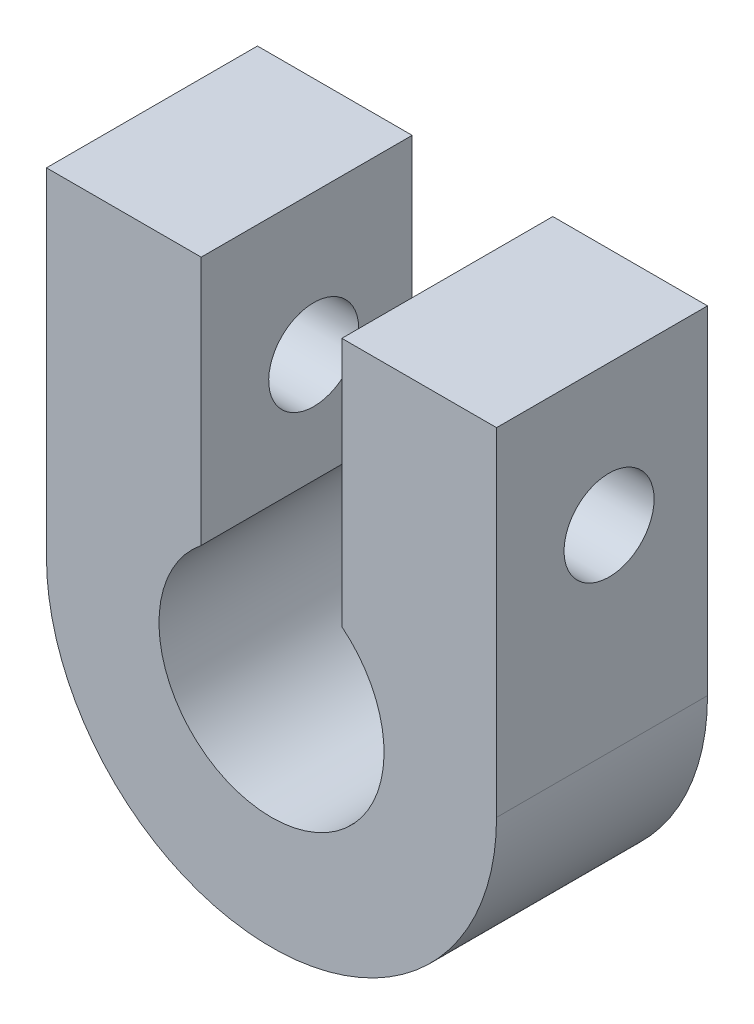
ISO-10303-21;
HEADER;
FILE_DESCRIPTION(('STEP AP214'),'2;1');
FILE_NAME('part.step','',(''),(''),'','','');
FILE_SCHEMA(('AUTOMOTIVE_DESIGN { 1 0 10303 214 1 1 1 1 }'));
ENDSEC;
DATA;
#1=APPLICATION_CONTEXT('core data for automotive mechanical design processes');
#2=APPLICATION_PROTOCOL_DEFINITION('international standard','automotive_design',2000,#1);
#3=PRODUCT_CONTEXT('',#1,'mechanical');
#4=PRODUCT('Part','Part','',(#3));
#5=PRODUCT_RELATED_PRODUCT_CATEGORY('part','',(#4));
#6=PRODUCT_DEFINITION_FORMATION('','',#4);
#7=PRODUCT_DEFINITION_CONTEXT('part definition',#1,'design');
#8=PRODUCT_DEFINITION('design','',#6,#7);
#9=PRODUCT_DEFINITION_SHAPE('','',#8);
#10=(LENGTH_UNIT() NAMED_UNIT(*) SI_UNIT(.MILLI.,.METRE.));
#11=(NAMED_UNIT(*) PLANE_ANGLE_UNIT() SI_UNIT($,.RADIAN.));
#12=(NAMED_UNIT(*) SI_UNIT($,.STERADIAN.) SOLID_ANGLE_UNIT());
#13=UNCERTAINTY_MEASURE_WITH_UNIT(LENGTH_MEASURE(1.E-05),#10,'distance_accuracy_value','');
#14=(GEOMETRIC_REPRESENTATION_CONTEXT(3) GLOBAL_UNCERTAINTY_ASSIGNED_CONTEXT((#13)) GLOBAL_UNIT_ASSIGNED_CONTEXT((#10,
#11,#12)) REPRESENTATION_CONTEXT('',''));
#15=CARTESIAN_POINT('',(0.,0.,0.));
#16=DIRECTION('',(0.,0.,1.));
#17=DIRECTION('',(1.,0.,0.));
#18=AXIS2_PLACEMENT_3D('',#15,#16,#17);
#19=CARTESIAN_POINT('',(8.,12.,0.));
#20=DIRECTION('',(0.,1.,0.));
#21=DIRECTION('',(0.,0.,1.));
#22=AXIS2_PLACEMENT_3D('',#19,#20,#21);
#23=PLANE('',#22);
#24=DIRECTION('',(0.,0.,-1.));
#25=VECTOR('',#24,1.);
#26=CARTESIAN_POINT('',(-2.5,12.,8.));
#27=LINE('',#26,#25);
#28=CARTESIAN_POINT('',(-2.5,12.,8.));
#29=VERTEX_POINT('',#28);
#30=CARTESIAN_POINT('',(-2.5,12.,0.500000000000002));
#31=VERTEX_POINT('',#30);
#32=EDGE_CURVE('E181',#29,#31,#27,.T.);
#33=ORIENTED_EDGE('',*,*,#32,.T.);
#34=DIRECTION('',(-1.,0.,0.));
#35=VECTOR('',#34,1.);
#36=CARTESIAN_POINT('',(-8.,12.,0.500000000000002));
#37=LINE('',#36,#35);
#38=CARTESIAN_POINT('',(-8.,12.,0.500000000000002));
#39=VERTEX_POINT('',#38);
#40=EDGE_CURVE('E209',#31,#39,#37,.T.);
#41=ORIENTED_EDGE('',*,*,#40,.T.);
#42=DIRECTION('',(0.,0.,1.));
#43=VECTOR('',#42,1.);
#44=CARTESIAN_POINT('',(-8.,12.,0.));
#45=LINE('',#44,#43);
#46=CARTESIAN_POINT('',(-8.,12.,8.));
#47=VERTEX_POINT('',#46);
#48=EDGE_CURVE('E210',#39,#47,#45,.T.);
#49=ORIENTED_EDGE('',*,*,#48,.T.);
#50=DIRECTION('',(-1.,0.,0.));
#51=VECTOR('',#50,1.);
#52=CARTESIAN_POINT('',(8.,12.,8.));
#53=LINE('',#52,#51);
#54=EDGE_CURVE('E200',#29,#47,#53,.T.);
#55=ORIENTED_EDGE('',*,*,#54,.F.);
#56=EDGE_LOOP('',(#33,#41,#49,#55));
#57=FACE_BOUND('',#56,.T.);
#58=ADVANCED_FACE('F34',(#57),#23,.T.);
#59=CARTESIAN_POINT('',(0.,0.,0.));
#60=DIRECTION('',(0.,0.,1.));
#61=DIRECTION('',(1.,0.,0.));
#62=AXIS2_PLACEMENT_3D('',#59,#60,#61);
#63=CYLINDRICAL_SURFACE('',#62,8.);
#64=DIRECTION('',(0.,0.,1.));
#65=VECTOR('',#64,1.);
#66=CARTESIAN_POINT('',(-8.,0.,0.));
#67=LINE('',#66,#65);
#68=CARTESIAN_POINT('',(-8.,0.,0.500000000000002));
#69=VERTEX_POINT('',#68);
#70=CARTESIAN_POINT('',(-8.,0.,8.));
#71=VERTEX_POINT('',#70);
#72=EDGE_CURVE('E207',#69,#71,#67,.T.);
#73=ORIENTED_EDGE('',*,*,#72,.F.);
#74=CARTESIAN_POINT('',(0.,0.,0.500000000000002));
#75=DIRECTION('',(0.,0.,1.));
#76=DIRECTION('',(1.,0.,0.));
#77=AXIS2_PLACEMENT_3D('',#74,#75,#76);
#78=CIRCLE('',#77,8.);
#79=CARTESIAN_POINT('',(8.,0.,0.500000000000002));
#80=VERTEX_POINT('',#79);
#81=EDGE_CURVE('E236',#69,#80,#78,.T.);
#82=ORIENTED_EDGE('',*,*,#81,.T.);
#83=DIRECTION('',(0.,0.,1.));
#84=VECTOR('',#83,1.);
#85=CARTESIAN_POINT('',(8.,0.,0.));
#86=LINE('',#85,#84);
#87=CARTESIAN_POINT('',(8.,0.,8.));
#88=VERTEX_POINT('',#87);
#89=EDGE_CURVE('E206',#80,#88,#86,.T.);
#90=ORIENTED_EDGE('',*,*,#89,.T.);
#91=CARTESIAN_POINT('',(0.,0.,8.));
#92=DIRECTION('',(0.,0.,1.));
#93=DIRECTION('',(1.,0.,0.));
#94=AXIS2_PLACEMENT_3D('',#91,#92,#93);
#95=CIRCLE('',#94,8.);
#96=EDGE_CURVE('E164',#71,#88,#95,.T.);
#97=ORIENTED_EDGE('',*,*,#96,.F.);
#98=EDGE_LOOP('',(#73,#82,#90,#97));
#99=FACE_BOUND('',#98,.T.);
#100=ADVANCED_FACE('F386',(#99),#63,.T.);
#101=CARTESIAN_POINT('',(-8.,12.,0.));
#102=DIRECTION('',(-1.,0.,0.));
#103=DIRECTION('',(0.,0.,1.));
#104=AXIS2_PLACEMENT_3D('',#101,#102,#103);
#105=PLANE('',#104);
#106=DIRECTION('',(0.,0.,1.));
#107=VECTOR('',#106,1.);
#108=CARTESIAN_POINT('',(-8.,4.100001352125,2.325685));
#109=LINE('',#108,#107);
#110=CARTESIAN_POINT('',(-8.,4.100001352125,2.325685));
#111=VERTEX_POINT('',#110);
#112=CARTESIAN_POINT('',(-8.,4.10000135212497,5.67431499999981));
#113=VERTEX_POINT('',#112);
#114=EDGE_CURVE('E176',#111,#113,#109,.T.);
#115=ORIENTED_EDGE('',*,*,#114,.F.);
#116=DIRECTION('',(0.,-0.866025403784429,0.500000000000017));
#117=VECTOR('',#116,1.);
#118=CARTESIAN_POINT('',(-8.,6.99999999999989,0.651369999999807));
#119=LINE('',#118,#117);
#120=CARTESIAN_POINT('',(-8.,6.99999999999989,0.651369999999807));
#121=VERTEX_POINT('',#120);
#122=EDGE_CURVE('E312',#121,#111,#119,.T.);
#123=ORIENTED_EDGE('',*,*,#122,.F.);
#124=DIRECTION('',(0.,-0.866025403784439,-0.5));
#125=VECTOR('',#124,1.);
#126=CARTESIAN_POINT('',(-8.,9.89999864787498,2.32568500000004));
#127=LINE('',#126,#125);
#128=CARTESIAN_POINT('',(-8.,9.89999864787498,2.32568500000004));
#129=VERTEX_POINT('',#128);
#130=EDGE_CURVE('E337',#129,#121,#127,.T.);
#131=ORIENTED_EDGE('',*,*,#130,.F.);
#132=DIRECTION('',(0.,0.,-1.));
#133=VECTOR('',#132,1.);
#134=CARTESIAN_POINT('',(-8.,9.89999864787498,5.67431499999985));
#135=LINE('',#134,#133);
#136=CARTESIAN_POINT('',(-8.,9.89999864787498,5.67431499999985));
#137=VERTEX_POINT('',#136);
#138=EDGE_CURVE('E334',#137,#129,#135,.T.);
#139=ORIENTED_EDGE('',*,*,#138,.F.);
#140=DIRECTION('',(0.,0.866025403784431,-0.500000000000013));
#141=VECTOR('',#140,1.);
#142=CARTESIAN_POINT('',(-8.,7.00000000000006,7.34863000000004));
#143=LINE('',#142,#141);
#144=CARTESIAN_POINT('',(-8.,7.00000000000006,7.34863000000004));
#145=VERTEX_POINT('',#144);
#146=EDGE_CURVE('E331',#145,#137,#143,.T.);
#147=ORIENTED_EDGE('',*,*,#146,.F.);
#148=DIRECTION('',(0.,0.866025403784439,0.5));
#149=VECTOR('',#148,1.);
#150=CARTESIAN_POINT('',(-8.,4.10000135212497,5.67431499999981));
#151=LINE('',#150,#149);
#152=EDGE_CURVE('E328',#113,#145,#151,.T.);
#153=ORIENTED_EDGE('',*,*,#152,.F.);
#154=EDGE_LOOP('',(#115,#123,#131,#139,#147,#153));
#155=FACE_BOUND('',#154,.T.);
#156=ORIENTED_EDGE('',*,*,#48,.F.);
#157=DIRECTION('',(0.,-1.,0.));
#158=VECTOR('',#157,1.);
#159=CARTESIAN_POINT('',(-8.,0.,0.500000000000002));
#160=LINE('',#159,#158);
#161=EDGE_CURVE('E234',#39,#69,#160,.T.);
#162=ORIENTED_EDGE('',*,*,#161,.T.);
#163=ORIENTED_EDGE('',*,*,#72,.T.);
#164=DIRECTION('',(0.,-1.,0.));
#165=VECTOR('',#164,1.);
#166=CARTESIAN_POINT('',(-8.,12.,8.));
#167=LINE('',#166,#165);
#168=EDGE_CURVE('E203',#47,#71,#167,.T.);
#169=ORIENTED_EDGE('',*,*,#168,.F.);
#170=EDGE_LOOP('',(#156,#162,#163,#169));
#171=FACE_BOUND('',#170,.T.);
#172=ADVANCED_FACE('F359',(#155,#171),#105,.T.);
#173=DIRECTION('',(0.,0.,1.));
#174=VECTOR('',#173,1.);
#175=CARTESIAN_POINT('',(8.,12.,0.));
#176=LINE('',#175,#174);
#177=CARTESIAN_POINT('',(8.,12.,0.500000000000002));
#178=VERTEX_POINT('',#177);
#179=CARTESIAN_POINT('',(8.,12.,8.));
#180=VERTEX_POINT('',#179);
#181=EDGE_CURVE('E212',#178,#180,#176,.T.);
#182=ORIENTED_EDGE('',*,*,#181,.F.);
#183=DIRECTION('',(-1.,0.,0.));
#184=VECTOR('',#183,1.);
#185=CARTESIAN_POINT('',(2.5,12.,0.500000000000002));
#186=LINE('',#185,#184);
#187=CARTESIAN_POINT('',(2.5,12.,0.500000000000002));
#188=VERTEX_POINT('',#187);
#189=EDGE_CURVE('E240',#178,#188,#186,.T.);
#190=ORIENTED_EDGE('',*,*,#189,.T.);
#191=DIRECTION('',(0.,0.,-1.));
#192=VECTOR('',#191,1.);
#193=CARTESIAN_POINT('',(2.5,12.,8.));
#194=LINE('',#193,#192);
#195=CARTESIAN_POINT('',(2.5,12.,8.));
#196=VERTEX_POINT('',#195);
#197=EDGE_CURVE('E192',#196,#188,#194,.T.);
#198=ORIENTED_EDGE('',*,*,#197,.F.);
#199=EDGE_CURVE('E201',#180,#196,#53,.T.);
#200=ORIENTED_EDGE('',*,*,#199,.F.);
#201=EDGE_LOOP('',(#182,#190,#198,#200));
#202=FACE_BOUND('',#201,.T.);
#203=ADVANCED_FACE('F389',(#202),#23,.T.);
#204=CARTESIAN_POINT('',(8.,0.,0.));
#205=DIRECTION('',(1.,0.,0.));
#206=DIRECTION('',(0.,0.,-1.));
#207=AXIS2_PLACEMENT_3D('',#204,#205,#206);
#208=PLANE('',#207);
#209=CARTESIAN_POINT('',(8.,6.99999999999986,3.99999999999988));
#210=DIRECTION('',(1.,0.,0.));
#211=DIRECTION('',(0.,0.,-1.));
#212=AXIS2_PLACEMENT_3D('',#209,#210,#211);
#213=CIRCLE('',#212,1.59999999999975);
#214=CARTESIAN_POINT('',(8.,6.99999999999986,2.40000000000013));
#215=VERTEX_POINT('',#214);
#216=EDGE_CURVE('E292',#215,#215,#213,.T.);
#217=ORIENTED_EDGE('',*,*,#216,.F.);
#218=EDGE_LOOP('',(#217));
#219=FACE_BOUND('',#218,.T.);
#220=ORIENTED_EDGE('',*,*,#89,.F.);
#221=DIRECTION('',(0.,1.,0.));
#222=VECTOR('',#221,1.);
#223=CARTESIAN_POINT('',(8.,12.,0.500000000000002));
#224=LINE('',#223,#222);
#225=EDGE_CURVE('E238',#80,#178,#224,.T.);
#226=ORIENTED_EDGE('',*,*,#225,.T.);
#227=ORIENTED_EDGE('',*,*,#181,.T.);
#228=DIRECTION('',(0.,1.,0.));
#229=VECTOR('',#228,1.);
#230=CARTESIAN_POINT('',(8.,0.,8.));
#231=LINE('',#230,#229);
#232=EDGE_CURVE('E197',#88,#180,#231,.T.);
#233=ORIENTED_EDGE('',*,*,#232,.F.);
#234=EDGE_LOOP('',(#220,#226,#227,#233));
#235=FACE_BOUND('',#234,.T.);
#236=ADVANCED_FACE('F398',(#219,#235),#208,.T.);
#237=CARTESIAN_POINT('',(0.,0.,0.));
#238=DIRECTION('',(0.,0.,1.));
#239=DIRECTION('',(1.,0.,0.));
#240=AXIS2_PLACEMENT_3D('',#237,#238,#239);
#241=PLANE('',#240);
#242=DIRECTION('',(0.,1.,0.));
#243=VECTOR('',#242,1.);
#244=CARTESIAN_POINT('',(-7.5,12.,0.));
#245=LINE('',#244,#243);
#246=CARTESIAN_POINT('',(-7.5,0.,0.));
#247=VERTEX_POINT('',#246);
#248=CARTESIAN_POINT('',(-7.5,11.5,0.));
#249=VERTEX_POINT('',#248);
#250=EDGE_CURVE('E229',#247,#249,#245,.T.);
#251=ORIENTED_EDGE('',*,*,#250,.T.);
#252=DIRECTION('',(1.,0.,0.));
#253=VECTOR('',#252,1.);
#254=CARTESIAN_POINT('',(-2.5,11.5,0.));
#255=LINE('',#254,#253);
#256=CARTESIAN_POINT('',(-3.,11.5,0.));
#257=VERTEX_POINT('',#256);
#258=EDGE_CURVE('E231',#249,#257,#255,.T.);
#259=ORIENTED_EDGE('',*,*,#258,.T.);
#260=DIRECTION('',(0.,-1.,0.));
#261=VECTOR('',#260,1.);
#262=CARTESIAN_POINT('',(-3.00000000000007,0.,0.));
#263=LINE('',#262,#261);
#264=CARTESIAN_POINT('',(-2.99999999999927,3.35410196625034,0.));
#265=VERTEX_POINT('',#264);
#266=EDGE_CURVE('E221',#257,#265,#263,.T.);
#267=ORIENTED_EDGE('',*,*,#266,.T.);
#268=CARTESIAN_POINT('',(0.,0.,0.));
#269=DIRECTION('',(0.,0.,1.));
#270=DIRECTION('',(1.,0.,0.));
#271=AXIS2_PLACEMENT_3D('',#268,#269,#270);
#272=CIRCLE('',#271,4.5);
#273=CARTESIAN_POINT('',(3.00000000000005,3.35410196625034,0.));
#274=VERTEX_POINT('',#273);
#275=EDGE_CURVE('E219',#265,#274,#272,.T.);
#276=ORIENTED_EDGE('',*,*,#275,.T.);
#277=DIRECTION('',(0.,1.,0.));
#278=VECTOR('',#277,1.);
#279=CARTESIAN_POINT('',(3.00000000000007,0.,0.));
#280=LINE('',#279,#278);
#281=CARTESIAN_POINT('',(3.,11.5,0.));
#282=VERTEX_POINT('',#281);
#283=EDGE_CURVE('E217',#274,#282,#280,.T.);
#284=ORIENTED_EDGE('',*,*,#283,.T.);
#285=DIRECTION('',(1.,0.,0.));
#286=VECTOR('',#285,1.);
#287=CARTESIAN_POINT('',(8.,11.5,0.));
#288=LINE('',#287,#286);
#289=CARTESIAN_POINT('',(7.5,11.5,0.));
#290=VERTEX_POINT('',#289);
#291=EDGE_CURVE('E223',#282,#290,#288,.T.);
#292=ORIENTED_EDGE('',*,*,#291,.T.);
#293=DIRECTION('',(0.,-1.,0.));
#294=VECTOR('',#293,1.);
#295=CARTESIAN_POINT('',(7.5,0.,0.));
#296=LINE('',#295,#294);
#297=CARTESIAN_POINT('',(7.5,0.,0.));
#298=VERTEX_POINT('',#297);
#299=EDGE_CURVE('E225',#290,#298,#296,.T.);
#300=ORIENTED_EDGE('',*,*,#299,.T.);
#301=CARTESIAN_POINT('',(0.,0.,0.));
#302=DIRECTION('',(0.,0.,1.));
#303=DIRECTION('',(1.,0.,0.));
#304=AXIS2_PLACEMENT_3D('',#301,#302,#303);
#305=CIRCLE('',#304,7.5);
#306=EDGE_CURVE('E227',#298,#247,#305,.F.);
#307=ORIENTED_EDGE('',*,*,#306,.T.);
#308=EDGE_LOOP('',(#251,#259,#267,#276,#284,#292,#300,#307));
#309=FACE_BOUND('',#308,.T.);
#310=ADVANCED_FACE('F404',(#309),#241,.F.);
#311=CARTESIAN_POINT('',(0.,0.,8.));
#312=DIRECTION('',(0.,0.,1.));
#313=DIRECTION('',(1.,0.,0.));
#314=AXIS2_PLACEMENT_3D('',#311,#312,#313);
#315=PLANE('',#314);
#316=CARTESIAN_POINT('',(0.,0.,8.));
#317=DIRECTION('',(0.,0.,1.));
#318=DIRECTION('',(1.,0.,0.));
#319=AXIS2_PLACEMENT_3D('',#316,#317,#318);
#320=CIRCLE('',#319,4.);
#321=CARTESIAN_POINT('',(-2.50000000000005,3.12249899919916,8.));
#322=VERTEX_POINT('',#321);
#323=CARTESIAN_POINT('',(2.50000000000005,3.12249899919916,8.));
#324=VERTEX_POINT('',#323);
#325=EDGE_CURVE('E160',#322,#324,#320,.T.);
#326=ORIENTED_EDGE('',*,*,#325,.F.);
#327=DIRECTION('',(0.,1.,0.));
#328=VECTOR('',#327,1.);
#329=CARTESIAN_POINT('',(-2.50000000000005,3.12249899919916,8.));
#330=LINE('',#329,#328);
#331=EDGE_CURVE('E172',#322,#29,#330,.T.);
#332=ORIENTED_EDGE('',*,*,#331,.T.);
#333=ORIENTED_EDGE('',*,*,#54,.T.);
#334=ORIENTED_EDGE('',*,*,#168,.T.);
#335=ORIENTED_EDGE('',*,*,#96,.T.);
#336=ORIENTED_EDGE('',*,*,#232,.T.);
#337=ORIENTED_EDGE('',*,*,#199,.T.);
#338=DIRECTION('',(0.,-1.,0.));
#339=VECTOR('',#338,1.);
#340=CARTESIAN_POINT('',(2.5,12.,8.));
#341=LINE('',#340,#339);
#342=EDGE_CURVE('E175',#196,#324,#341,.T.);
#343=ORIENTED_EDGE('',*,*,#342,.T.);
#344=EDGE_LOOP('',(#326,#332,#333,#334,#335,#336,#337,#343));
#345=FACE_BOUND('',#344,.T.);
#346=ADVANCED_FACE('F170',(#345),#315,.T.);
#347=CARTESIAN_POINT('',(-2.50000000000005,3.12249899919916,8.));
#348=DIRECTION('',(-1.,0.,0.));
#349=DIRECTION('',(0.,-1.,0.));
#350=AXIS2_PLACEMENT_3D('',#347,#348,#349);
#351=PLANE('',#350);
#352=CARTESIAN_POINT('',(-2.50000000000003,6.99999999999986,3.99999999999988));
#353=DIRECTION('',(-1.,0.,0.));
#354=DIRECTION('',(0.,-1.,0.));
#355=AXIS2_PLACEMENT_3D('',#352,#353,#354);
#356=CIRCLE('',#355,1.59999999999975);
#357=CARTESIAN_POINT('',(-2.50000000000004,5.40000000000011,3.99999999999988));
#358=VERTEX_POINT('',#357);
#359=EDGE_CURVE('E177',#358,#358,#356,.T.);
#360=ORIENTED_EDGE('',*,*,#359,.T.);
#361=EDGE_LOOP('',(#360));
#362=FACE_BOUND('',#361,.T.);
#363=DIRECTION('',(0.,0.,-1.));
#364=VECTOR('',#363,1.);
#365=CARTESIAN_POINT('',(-2.50000000000005,3.12249899919916,8.));
#366=LINE('',#365,#364);
#367=CARTESIAN_POINT('',(-2.50000000000005,3.12249899919916,0.500000000000002));
#368=VERTEX_POINT('',#367);
#369=EDGE_CURVE('E157',#322,#368,#366,.T.);
#370=ORIENTED_EDGE('',*,*,#369,.T.);
#371=DIRECTION('',(0.,1.,0.));
#372=VECTOR('',#371,1.);
#373=CARTESIAN_POINT('',(-2.50000000000005,3.12249899919916,0.500000000000002));
#374=LINE('',#373,#372);
#375=EDGE_CURVE('E242',#368,#31,#374,.T.);
#376=ORIENTED_EDGE('',*,*,#375,.T.);
#377=ORIENTED_EDGE('',*,*,#32,.F.);
#378=ORIENTED_EDGE('',*,*,#331,.F.);
#379=EDGE_LOOP('',(#370,#376,#377,#378));
#380=FACE_BOUND('',#379,.T.);
#381=ADVANCED_FACE('F179',(#362,#380),#351,.F.);
#382=CARTESIAN_POINT('',(2.5,12.,8.));
#383=DIRECTION('',(1.,0.,0.));
#384=DIRECTION('',(0.,1.,0.));
#385=AXIS2_PLACEMENT_3D('',#382,#383,#384);
#386=PLANE('',#385);
#387=CARTESIAN_POINT('',(2.50000000000003,6.99999999999986,3.99999999999988));
#388=DIRECTION('',(1.,0.,0.));
#389=DIRECTION('',(0.,1.,0.));
#390=AXIS2_PLACEMENT_3D('',#387,#388,#389);
#391=CIRCLE('',#390,1.59999999999975);
#392=CARTESIAN_POINT('',(2.50000000000002,8.59999999999961,3.99999999999988));
#393=VERTEX_POINT('',#392);
#394=EDGE_CURVE('E296',#393,#393,#391,.T.);
#395=ORIENTED_EDGE('',*,*,#394,.T.);
#396=EDGE_LOOP('',(#395));
#397=FACE_BOUND('',#396,.T.);
#398=ORIENTED_EDGE('',*,*,#197,.T.);
#399=DIRECTION('',(0.,-1.,0.));
#400=VECTOR('',#399,1.);
#401=CARTESIAN_POINT('',(2.5,12.,0.500000000000002));
#402=LINE('',#401,#400);
#403=CARTESIAN_POINT('',(2.50000000000005,3.12249899919916,0.500000000000002));
#404=VERTEX_POINT('',#403);
#405=EDGE_CURVE('E11',#188,#404,#402,.T.);
#406=ORIENTED_EDGE('',*,*,#405,.T.);
#407=DIRECTION('',(0.,0.,-1.));
#408=VECTOR('',#407,1.);
#409=CARTESIAN_POINT('',(2.50000000000005,3.12249899919916,8.));
#410=LINE('',#409,#408);
#411=EDGE_CURVE('E165',#324,#404,#410,.T.);
#412=ORIENTED_EDGE('',*,*,#411,.F.);
#413=ORIENTED_EDGE('',*,*,#342,.F.);
#414=EDGE_LOOP('',(#398,#406,#412,#413));
#415=FACE_BOUND('',#414,.T.);
#416=ADVANCED_FACE('F510',(#397,#415),#386,.F.);
#417=CARTESIAN_POINT('',(-6.01,4.100001352125,2.325685));
#418=DIRECTION('',(0.,-1.,0.));
#419=DIRECTION('',(0.,0.,-1.));
#420=AXIS2_PLACEMENT_3D('',#417,#418,#419);
#421=PLANE('',#420);
#422=ORIENTED_EDGE('',*,*,#114,.T.);
#423=DIRECTION('',(-1.,0.,0.));
#424=VECTOR('',#423,1.);
#425=CARTESIAN_POINT('',(-6.01,4.10000135212497,5.67431499999981));
#426=LINE('',#425,#424);
#427=CARTESIAN_POINT('',(-6.01,4.10000135212497,5.67431499999981));
#428=VERTEX_POINT('',#427);
#429=EDGE_CURVE('E188',#428,#113,#426,.T.);
#430=ORIENTED_EDGE('',*,*,#429,.F.);
#431=DIRECTION('',(0.,0.,1.));
#432=VECTOR('',#431,1.);
#433=CARTESIAN_POINT('',(-6.01,4.100001352125,2.325685));
#434=LINE('',#433,#432);
#435=CARTESIAN_POINT('',(-6.01,4.100001352125,2.325685));
#436=VERTEX_POINT('',#435);
#437=EDGE_CURVE('E308',#436,#428,#434,.T.);
#438=ORIENTED_EDGE('',*,*,#437,.F.);
#439=DIRECTION('',(-1.,0.,0.));
#440=VECTOR('',#439,1.);
#441=CARTESIAN_POINT('',(-6.01,4.100001352125,2.325685));
#442=LINE('',#441,#440);
#443=EDGE_CURVE('E182',#436,#111,#442,.T.);
#444=ORIENTED_EDGE('',*,*,#443,.T.);
#445=EDGE_LOOP('',(#422,#430,#438,#444));
#446=FACE_BOUND('',#445,.T.);
#447=ADVANCED_FACE('F372',(#446),#421,.F.);
#448=CARTESIAN_POINT('',(-6.01,6.99999999999989,0.651369999999807));
#449=DIRECTION('',(0.,-0.500000000000017,-0.866025403784429));
#450=DIRECTION('',(0.,0.866025403784429,-0.500000000000017));
#451=AXIS2_PLACEMENT_3D('',#448,#449,#450);
#452=PLANE('',#451);
#453=ORIENTED_EDGE('',*,*,#122,.T.);
#454=ORIENTED_EDGE('',*,*,#443,.F.);
#455=DIRECTION('',(0.,-0.866025403784429,0.500000000000017));
#456=VECTOR('',#455,1.);
#457=CARTESIAN_POINT('',(-6.01,6.99999999999989,0.651369999999807));
#458=LINE('',#457,#456);
#459=CARTESIAN_POINT('',(-6.01,6.99999999999989,0.651369999999807));
#460=VERTEX_POINT('',#459);
#461=EDGE_CURVE('E324',#460,#436,#458,.T.);
#462=ORIENTED_EDGE('',*,*,#461,.F.);
#463=DIRECTION('',(-1.,0.,0.));
#464=VECTOR('',#463,1.);
#465=CARTESIAN_POINT('',(-6.01,6.99999999999989,0.651369999999807));
#466=LINE('',#465,#464);
#467=EDGE_CURVE('E185',#460,#121,#466,.T.);
#468=ORIENTED_EDGE('',*,*,#467,.T.);
#469=EDGE_LOOP('',(#453,#454,#462,#468));
#470=FACE_BOUND('',#469,.T.);
#471=ADVANCED_FACE('F374',(#470),#452,.F.);
#472=CARTESIAN_POINT('',(-6.01,9.89999864787498,2.32568500000004));
#473=DIRECTION('',(0.,0.5,-0.866025403784439));
#474=DIRECTION('',(0.,0.866025403784439,0.5));
#475=AXIS2_PLACEMENT_3D('',#472,#473,#474);
#476=PLANE('',#475);
#477=ORIENTED_EDGE('',*,*,#130,.T.);
#478=ORIENTED_EDGE('',*,*,#467,.F.);
#479=DIRECTION('',(0.,-0.866025403784439,-0.5));
#480=VECTOR('',#479,1.);
#481=CARTESIAN_POINT('',(-6.01,9.89999864787498,2.32568500000004));
#482=LINE('',#481,#480);
#483=CARTESIAN_POINT('',(-6.01,9.89999864787498,2.32568500000004));
#484=VERTEX_POINT('',#483);
#485=EDGE_CURVE('E321',#484,#460,#482,.T.);
#486=ORIENTED_EDGE('',*,*,#485,.F.);
#487=DIRECTION('',(-1.,0.,0.));
#488=VECTOR('',#487,1.);
#489=CARTESIAN_POINT('',(-6.01,9.89999864787498,2.32568500000004));
#490=LINE('',#489,#488);
#491=EDGE_CURVE('E343',#484,#129,#490,.T.);
#492=ORIENTED_EDGE('',*,*,#491,.T.);
#493=EDGE_LOOP('',(#477,#478,#486,#492));
#494=FACE_BOUND('',#493,.T.);
#495=ADVANCED_FACE('F376',(#494),#476,.F.);
#496=CARTESIAN_POINT('',(-6.01,9.89999864787498,5.67431499999985));
#497=DIRECTION('',(0.,1.,0.));
#498=DIRECTION('',(0.,0.,1.));
#499=AXIS2_PLACEMENT_3D('',#496,#497,#498);
#500=PLANE('',#499);
#501=ORIENTED_EDGE('',*,*,#138,.T.);
#502=ORIENTED_EDGE('',*,*,#491,.F.);
#503=DIRECTION('',(0.,0.,-1.));
#504=VECTOR('',#503,1.);
#505=CARTESIAN_POINT('',(-6.01,9.89999864787498,5.67431499999985));
#506=LINE('',#505,#504);
#507=CARTESIAN_POINT('',(-6.01,9.89999864787498,5.67431499999985));
#508=VERTEX_POINT('',#507);
#509=EDGE_CURVE('E318',#508,#484,#506,.T.);
#510=ORIENTED_EDGE('',*,*,#509,.F.);
#511=DIRECTION('',(-1.,0.,0.));
#512=VECTOR('',#511,1.);
#513=CARTESIAN_POINT('',(-6.01,9.89999864787498,5.67431499999985));
#514=LINE('',#513,#512);
#515=EDGE_CURVE('E345',#508,#137,#514,.T.);
#516=ORIENTED_EDGE('',*,*,#515,.T.);
#517=EDGE_LOOP('',(#501,#502,#510,#516));
#518=FACE_BOUND('',#517,.T.);
#519=ADVANCED_FACE('F367',(#518),#500,.F.);
#520=CARTESIAN_POINT('',(-6.01,7.00000000000006,7.34863000000004));
#521=DIRECTION('',(0.,0.500000000000013,0.866025403784431));
#522=DIRECTION('',(0.,-0.866025403784431,0.500000000000013));
#523=AXIS2_PLACEMENT_3D('',#520,#521,#522);
#524=PLANE('',#523);
#525=ORIENTED_EDGE('',*,*,#146,.T.);
#526=ORIENTED_EDGE('',*,*,#515,.F.);
#527=DIRECTION('',(0.,0.866025403784431,-0.500000000000013));
#528=VECTOR('',#527,1.);
#529=CARTESIAN_POINT('',(-6.01,7.00000000000006,7.34863000000004));
#530=LINE('',#529,#528);
#531=CARTESIAN_POINT('',(-6.01,7.00000000000006,7.34863000000004));
#532=VERTEX_POINT('',#531);
#533=EDGE_CURVE('E315',#532,#508,#530,.T.);
#534=ORIENTED_EDGE('',*,*,#533,.F.);
#535=DIRECTION('',(-1.,0.,0.));
#536=VECTOR('',#535,1.);
#537=CARTESIAN_POINT('',(-6.01,7.00000000000006,7.34863000000004));
#538=LINE('',#537,#536);
#539=EDGE_CURVE('E346',#532,#145,#538,.T.);
#540=ORIENTED_EDGE('',*,*,#539,.T.);
#541=EDGE_LOOP('',(#525,#526,#534,#540));
#542=FACE_BOUND('',#541,.T.);
#543=ADVANCED_FACE('F364',(#542),#524,.F.);
#544=CARTESIAN_POINT('',(-6.01,4.10000135212497,5.67431499999981));
#545=DIRECTION('',(0.,-0.5,0.866025403784439));
#546=DIRECTION('',(0.,-0.866025403784439,-0.5));
#547=AXIS2_PLACEMENT_3D('',#544,#545,#546);
#548=PLANE('',#547);
#549=ORIENTED_EDGE('',*,*,#152,.T.);
#550=ORIENTED_EDGE('',*,*,#539,.F.);
#551=DIRECTION('',(0.,0.866025403784439,0.5));
#552=VECTOR('',#551,1.);
#553=CARTESIAN_POINT('',(-6.01,4.10000135212497,5.67431499999981));
#554=LINE('',#553,#552);
#555=EDGE_CURVE('E311',#428,#532,#554,.T.);
#556=ORIENTED_EDGE('',*,*,#555,.F.);
#557=ORIENTED_EDGE('',*,*,#429,.T.);
#558=EDGE_LOOP('',(#549,#550,#556,#557));
#559=FACE_BOUND('',#558,.T.);
#560=ADVANCED_FACE('F353',(#559),#548,.F.);
#561=CARTESIAN_POINT('',(-6.01,0.,0.));
#562=DIRECTION('',(-1.,0.,0.));
#563=DIRECTION('',(0.,0.,1.));
#564=AXIS2_PLACEMENT_3D('',#561,#562,#563);
#565=PLANE('',#564);
#566=CARTESIAN_POINT('',(-6.01,6.99999999999986,3.99999999999988));
#567=DIRECTION('',(-1.,0.,0.));
#568=DIRECTION('',(0.,0.,1.));
#569=AXIS2_PLACEMENT_3D('',#566,#567,#568);
#570=CIRCLE('',#569,1.59999999999975);
#571=CARTESIAN_POINT('',(-6.01,6.99999999999986,5.59999999999962));
#572=VERTEX_POINT('',#571);
#573=EDGE_CURVE('E301',#572,#572,#570,.T.);
#574=ORIENTED_EDGE('',*,*,#573,.F.);
#575=EDGE_LOOP('',(#574));
#576=FACE_BOUND('',#575,.T.);
#577=ORIENTED_EDGE('',*,*,#437,.T.);
#578=ORIENTED_EDGE('',*,*,#555,.T.);
#579=ORIENTED_EDGE('',*,*,#533,.T.);
#580=ORIENTED_EDGE('',*,*,#509,.T.);
#581=ORIENTED_EDGE('',*,*,#485,.T.);
#582=ORIENTED_EDGE('',*,*,#461,.T.);
#583=EDGE_LOOP('',(#577,#578,#579,#580,#581,#582));
#584=FACE_BOUND('',#583,.T.);
#585=ADVANCED_FACE('F370',(#576,#584),#565,.T.);
#586=CARTESIAN_POINT('',(0.,0.,0.));
#587=DIRECTION('',(0.,0.,1.));
#588=DIRECTION('',(1.,0.,0.));
#589=AXIS2_PLACEMENT_3D('',#586,#587,#588);
#590=CYLINDRICAL_SURFACE('',#589,4.);
#591=ORIENTED_EDGE('',*,*,#411,.T.);
#592=CARTESIAN_POINT('',(0.,0.,0.500000000000002));
#593=DIRECTION('',(0.,0.,1.));
#594=DIRECTION('',(1.,0.,0.));
#595=AXIS2_PLACEMENT_3D('',#592,#593,#594);
#596=CIRCLE('',#595,4.);
#597=EDGE_CURVE('E43',#404,#368,#596,.F.);
#598=ORIENTED_EDGE('',*,*,#597,.T.);
#599=ORIENTED_EDGE('',*,*,#369,.F.);
#600=ORIENTED_EDGE('',*,*,#325,.T.);
#601=EDGE_LOOP('',(#591,#598,#599,#600));
#602=FACE_BOUND('',#601,.T.);
#603=ADVANCED_FACE('F159',(#602),#590,.F.);
#604=CARTESIAN_POINT('',(-8.,6.99999999999986,3.99999999999988));
#605=DIRECTION('',(1.,0.,0.));
#606=DIRECTION('',(0.,0.,-1.));
#607=AXIS2_PLACEMENT_3D('',#604,#605,#606);
#608=CYLINDRICAL_SURFACE('',#607,1.59999999999975);
#609=ORIENTED_EDGE('',*,*,#573,.T.);
#610=EDGE_LOOP('',(#609));
#611=FACE_BOUND('',#610,.T.);
#612=ORIENTED_EDGE('',*,*,#359,.F.);
#613=EDGE_LOOP('',(#612));
#614=FACE_BOUND('',#613,.T.);
#615=ADVANCED_FACE('F501',(#611,#614),#608,.F.);
#616=ORIENTED_EDGE('',*,*,#216,.T.);
#617=EDGE_LOOP('',(#616));
#618=FACE_BOUND('',#617,.T.);
#619=ORIENTED_EDGE('',*,*,#394,.F.);
#620=EDGE_LOOP('',(#619));
#621=FACE_BOUND('',#620,.T.);
#622=ADVANCED_FACE('F491',(#618,#621),#608,.F.);
#623=CARTESIAN_POINT('',(8.,12.,0.500000000000002));
#624=DIRECTION('',(0.,0.707106781186547,-0.707106781186547));
#625=DIRECTION('',(1.,0.,0.));
#626=AXIS2_PLACEMENT_3D('',#623,#624,#625);
#627=PLANE('',#626);
#628=DIRECTION('',(-0.577350269189626,-0.577350269189626,-0.577350269189626));
#629=VECTOR('',#628,1.);
#630=CARTESIAN_POINT('',(8.,12.,0.500000000000002));
#631=LINE('',#630,#629);
#632=EDGE_CURVE('E285',#290,#178,#631,.F.);
#633=ORIENTED_EDGE('',*,*,#632,.F.);
#634=ORIENTED_EDGE('',*,*,#291,.F.);
#635=DIRECTION('',(-0.577350269189628,0.577350269189625,0.577350269189625));
#636=VECTOR('',#635,1.);
#637=CARTESIAN_POINT('',(2.5,12.,0.500000000000002));
#638=LINE('',#637,#636);
#639=EDGE_CURVE('E38',#188,#282,#638,.F.);
#640=ORIENTED_EDGE('',*,*,#639,.F.);
#641=ORIENTED_EDGE('',*,*,#189,.F.);
#642=EDGE_LOOP('',(#633,#634,#640,#641));
#643=FACE_BOUND('',#642,.T.);
#644=ADVANCED_FACE('F36',(#643),#627,.T.);
#645=CARTESIAN_POINT('',(2.5,12.,0.500000000000002));
#646=DIRECTION('',(0.707106781186547,0.,0.707106781186547));
#647=DIRECTION('',(0.,-1.,0.));
#648=AXIS2_PLACEMENT_3D('',#645,#646,#647);
#649=PLANE('',#648);
#650=ORIENTED_EDGE('',*,*,#639,.T.);
#651=ORIENTED_EDGE('',*,*,#283,.F.);
#652=CARTESIAN_POINT('',(2.99999999999927,3.35410196625034,0.));
#653=CARTESIAN_POINT('',(2.91637815974499,3.31674782353857,0.0836218402546708));
#654=CARTESIAN_POINT('',(2.83290064128017,3.27877053771423,0.167099358719752));
#655=CARTESIAN_POINT('',(2.66623397366378,3.20156955279895,0.333766026336402));
#656=CARTESIAN_POINT('',(2.58304482546219,3.16234584960623,0.416955174537988));
#657=CARTESIAN_POINT('',(2.50000000000005,3.12249899919916,0.500000000000002));
#658=B_SPLINE_CURVE_WITH_KNOTS('',3,(#652,#653,#654,#655,#656,#657),.UNSPECIFIED.,.F.,.F.,(4,2,
4),(0.,0.372039511007156,0.744080246468279),.UNSPECIFIED.);
#659=EDGE_CURVE('E280',#404,#274,#658,.F.);
#660=ORIENTED_EDGE('',*,*,#659,.F.);
#661=ORIENTED_EDGE('',*,*,#405,.F.);
#662=EDGE_LOOP('',(#650,#651,#660,#661));
#663=FACE_BOUND('',#662,.T.);
#664=ADVANCED_FACE('F275',(#663),#649,.F.);
#665=CARTESIAN_POINT('',(8.,0.,0.500000000000002));
#666=DIRECTION('',(0.707106781186547,0.,-0.707106781186547));
#667=DIRECTION('',(0.,-1.,0.));
#668=AXIS2_PLACEMENT_3D('',#665,#666,#667);
#669=PLANE('',#668);
#670=ORIENTED_EDGE('',*,*,#632,.T.);
#671=ORIENTED_EDGE('',*,*,#225,.F.);
#672=DIRECTION('',(0.707106781186547,0.,0.707106781186547));
#673=VECTOR('',#672,1.);
#674=CARTESIAN_POINT('',(7.5,0.,0.));
#675=LINE('',#674,#673);
#676=EDGE_CURVE('E260',#298,#80,#675,.T.);
#677=ORIENTED_EDGE('',*,*,#676,.F.);
#678=ORIENTED_EDGE('',*,*,#299,.F.);
#679=EDGE_LOOP('',(#670,#671,#677,#678));
#680=FACE_BOUND('',#679,.T.);
#681=ADVANCED_FACE('F278',(#680),#669,.T.);
#682=CARTESIAN_POINT('',(0.,0.,0.));
#683=DIRECTION('',(0.,0.,-1.));
#684=DIRECTION('',(-1.,0.,0.));
#685=AXIS2_PLACEMENT_3D('',#682,#683,#684);
#686=CONICAL_SURFACE('',#685,4.5,0.785398163397448);
#687=ORIENTED_EDGE('',*,*,#659,.T.);
#688=ORIENTED_EDGE('',*,*,#275,.F.);
#689=CARTESIAN_POINT('',(-3.00000000000005,3.35410196625121,0.));
#690=CARTESIAN_POINT('',(-2.91637815974556,3.31674782353909,0.0836218402544929));
#691=CARTESIAN_POINT('',(-2.83290064128057,3.2787705377145,0.167099358719485));
#692=CARTESIAN_POINT('',(-2.66623397366392,3.20156955279893,0.333766026336135));
#693=CARTESIAN_POINT('',(-2.58304482546224,3.16234584960616,0.41695517453781));
#694=CARTESIAN_POINT('',(-2.50000000000005,3.12249899919916,0.500000000000002));
#695=B_SPLINE_CURVE_WITH_KNOTS('',3,(#689,#690,#691,#692,#693,#694),.UNSPECIFIED.,.F.,.F.,(4,2,
4),(0.,0.37203951100755,0.744080246469071),.UNSPECIFIED.);
#696=EDGE_CURVE('E252',#368,#265,#695,.F.);
#697=ORIENTED_EDGE('',*,*,#696,.F.);
#698=ORIENTED_EDGE('',*,*,#597,.F.);
#699=EDGE_LOOP('',(#687,#688,#697,#698));
#700=FACE_BOUND('',#699,.T.);
#701=ADVANCED_FACE('F262',(#700),#686,.F.);
#702=CARTESIAN_POINT('',(0.,0.,0.500000000000002));
#703=DIRECTION('',(0.,0.,1.));
#704=DIRECTION('',(1.,0.,0.));
#705=AXIS2_PLACEMENT_3D('',#702,#703,#704);
#706=CONICAL_SURFACE('',#705,8.,0.785398163397448);
#707=ORIENTED_EDGE('',*,*,#676,.T.);
#708=ORIENTED_EDGE('',*,*,#81,.F.);
#709=DIRECTION('',(-0.707106781186547,0.,0.707106781186547));
#710=VECTOR('',#709,1.);
#711=CARTESIAN_POINT('',(-7.5,0.,0.));
#712=LINE('',#711,#710);
#713=EDGE_CURVE('E249',#247,#69,#712,.T.);
#714=ORIENTED_EDGE('',*,*,#713,.F.);
#715=ORIENTED_EDGE('',*,*,#306,.F.);
#716=EDGE_LOOP('',(#707,#708,#714,#715));
#717=FACE_BOUND('',#716,.T.);
#718=ADVANCED_FACE('F270',(#717),#706,.T.);
#719=CARTESIAN_POINT('',(-2.50000000000005,3.12249899919916,0.500000000000002));
#720=DIRECTION('',(-0.707106781186548,0.,0.707106781186547));
#721=DIRECTION('',(0.,1.,0.));
#722=AXIS2_PLACEMENT_3D('',#719,#720,#721);
#723=PLANE('',#722);
#724=ORIENTED_EDGE('',*,*,#696,.T.);
#725=ORIENTED_EDGE('',*,*,#266,.F.);
#726=DIRECTION('',(-0.577350269189628,-0.577350269189625,-0.577350269189625));
#727=VECTOR('',#726,1.);
#728=CARTESIAN_POINT('',(-5.45916700026697,9.04083299973305,-2.45916700026695));
#729=LINE('',#728,#727);
#730=EDGE_CURVE('E247',#31,#257,#729,.T.);
#731=ORIENTED_EDGE('',*,*,#730,.F.);
#732=ORIENTED_EDGE('',*,*,#375,.F.);
#733=EDGE_LOOP('',(#724,#725,#731,#732));
#734=FACE_BOUND('',#733,.T.);
#735=ADVANCED_FACE('F265',(#734),#723,.F.);
#736=CARTESIAN_POINT('',(-8.,12.,0.500000000000002));
#737=DIRECTION('',(-0.707106781186547,0.,-0.707106781186547));
#738=DIRECTION('',(0.,1.,0.));
#739=AXIS2_PLACEMENT_3D('',#736,#737,#738);
#740=PLANE('',#739);
#741=ORIENTED_EDGE('',*,*,#713,.T.);
#742=ORIENTED_EDGE('',*,*,#161,.F.);
#743=DIRECTION('',(0.577350269189626,-0.577350269189626,-0.577350269189626));
#744=VECTOR('',#743,1.);
#745=CARTESIAN_POINT('',(-8.,12.,0.500000000000002));
#746=LINE('',#745,#744);
#747=EDGE_CURVE('E245',#249,#39,#746,.F.);
#748=ORIENTED_EDGE('',*,*,#747,.F.);
#749=ORIENTED_EDGE('',*,*,#250,.F.);
#750=EDGE_LOOP('',(#741,#742,#748,#749));
#751=FACE_BOUND('',#750,.T.);
#752=ADVANCED_FACE('F269',(#751),#740,.T.);
#753=CARTESIAN_POINT('',(8.,12.,0.500000000000002));
#754=DIRECTION('',(0.,0.707106781186547,-0.707106781186547));
#755=DIRECTION('',(1.,0.,0.));
#756=AXIS2_PLACEMENT_3D('',#753,#754,#755);
#757=PLANE('',#756);
#758=ORIENTED_EDGE('',*,*,#730,.T.);
#759=ORIENTED_EDGE('',*,*,#258,.F.);
#760=ORIENTED_EDGE('',*,*,#747,.T.);
#761=ORIENTED_EDGE('',*,*,#40,.F.);
#762=EDGE_LOOP('',(#758,#759,#760,#761));
#763=FACE_BOUND('',#762,.T.);
#764=ADVANCED_FACE('F437',(#763),#757,.T.);
#765=CLOSED_SHELL('',(#58,#100,#172,#203,#236,#310,#346,#381,#416,#447,#471,#495,#519,#543,#560,
#585,#603,#615,#622,#644,#664,#681,#701,#718,#735,#752,#764));
#766=MANIFOLD_SOLID_BREP('B2',#765);
#767=ADVANCED_BREP_SHAPE_REPRESENTATION('',(#18,#766),#14);
#768=SHAPE_DEFINITION_REPRESENTATION(#9,#767);
ENDSEC;
END-ISO-10303-21;
